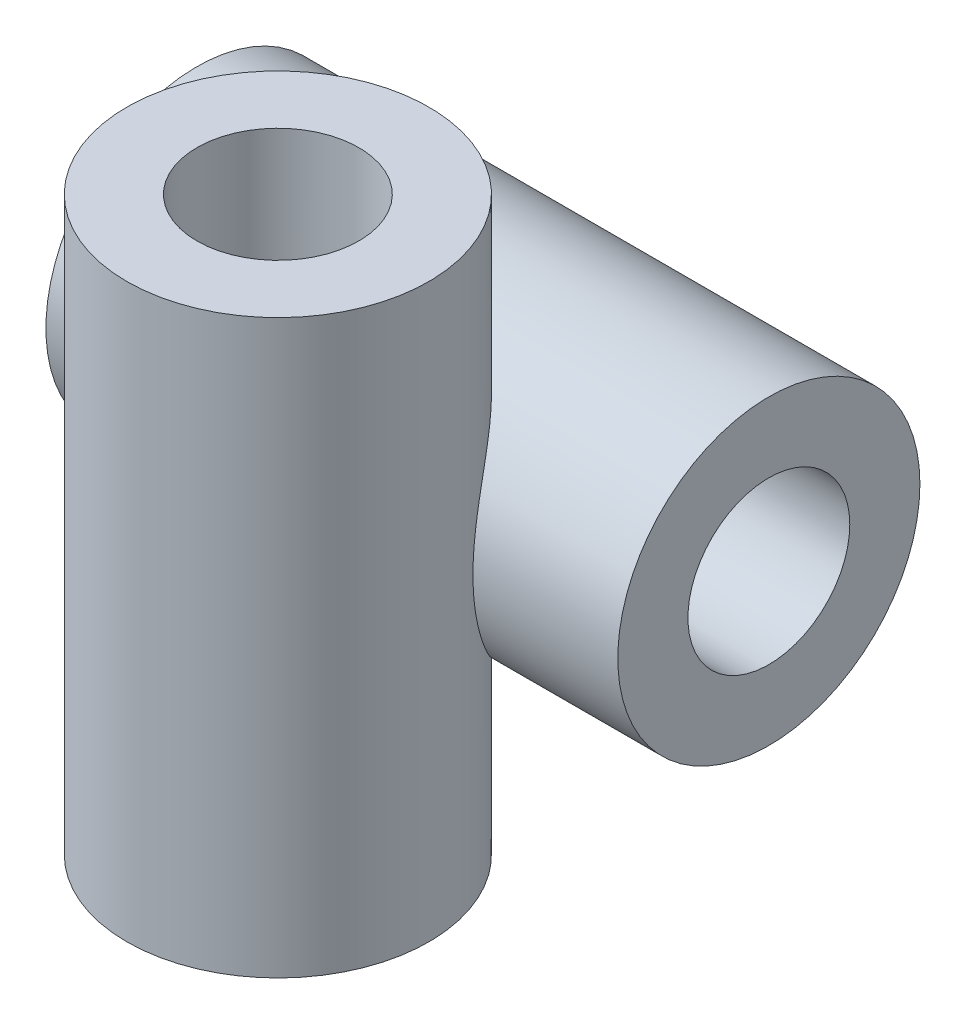
ISO-10303-21;
HEADER;
FILE_DESCRIPTION(('STEP AP214'),'2;1');
FILE_NAME('part.step','',(''),(''),'','','');
FILE_SCHEMA(('AUTOMOTIVE_DESIGN { 1 0 10303 214 1 1 1 1 }'));
ENDSEC;
DATA;
#1=APPLICATION_CONTEXT('core data for automotive mechanical design processes');
#2=APPLICATION_PROTOCOL_DEFINITION('international standard','automotive_design',2000,#1);
#3=PRODUCT_CONTEXT('',#1,'mechanical');
#4=PRODUCT('Part','Part','',(#3));
#5=PRODUCT_RELATED_PRODUCT_CATEGORY('part','',(#4));
#6=PRODUCT_DEFINITION_FORMATION('','',#4);
#7=PRODUCT_DEFINITION_CONTEXT('part definition',#1,'design');
#8=PRODUCT_DEFINITION('design','',#6,#7);
#9=PRODUCT_DEFINITION_SHAPE('','',#8);
#10=(LENGTH_UNIT() NAMED_UNIT(*) SI_UNIT(.MILLI.,.METRE.));
#11=(NAMED_UNIT(*) PLANE_ANGLE_UNIT() SI_UNIT($,.RADIAN.));
#12=(NAMED_UNIT(*) SI_UNIT($,.STERADIAN.) SOLID_ANGLE_UNIT());
#13=UNCERTAINTY_MEASURE_WITH_UNIT(LENGTH_MEASURE(1.E-05),#10,'distance_accuracy_value','');
#14=(GEOMETRIC_REPRESENTATION_CONTEXT(3) GLOBAL_UNCERTAINTY_ASSIGNED_CONTEXT((#13)) GLOBAL_UNIT_ASSIGNED_CONTEXT((#10,
#11,#12)) REPRESENTATION_CONTEXT('',''));
#15=CARTESIAN_POINT('',(0.,0.,0.));
#16=DIRECTION('',(0.,0.,1.));
#17=DIRECTION('',(1.,0.,0.));
#18=AXIS2_PLACEMENT_3D('',#15,#16,#17);
#19=CARTESIAN_POINT('',(1.55160412884561E-05,70.4899841667279,-12.71130350613));
#20=DIRECTION('',(0.,-1.,0.));
#21=DIRECTION('',(0.,0.,-1.));
#22=AXIS2_PLACEMENT_3D('',#19,#20,#21);
#23=CYLINDRICAL_SURFACE('',#22,9.24);
#24=CARTESIAN_POINT('',(1.55160412884561E-05,35.5099841667278,-12.71130350613));
#25=DIRECTION('',(0.,1.,0.));
#26=DIRECTION('',(0.,0.,1.));
#27=AXIS2_PLACEMENT_3D('',#24,#25,#26);
#28=CIRCLE('',#27,9.24);
#29=CARTESIAN_POINT('',(1.55160412884561E-05,35.5099841667278,-3.47130350612995));
#30=VERTEX_POINT('',#29);
#31=EDGE_CURVE('E56',#30,#30,#28,.T.);
#32=ORIENTED_EDGE('',*,*,#31,.T.);
#33=EDGE_LOOP('',(#32));
#34=FACE_BOUND('',#33,.T.);
#35=CARTESIAN_POINT('',(1.55160412884561E-05,70.4899841667279,-12.71130350613));
#36=DIRECTION('',(0.,1.,0.));
#37=DIRECTION('',(0.,0.,1.));
#38=AXIS2_PLACEMENT_3D('',#35,#36,#37);
#39=CIRCLE('',#38,9.24);
#40=CARTESIAN_POINT('',(1.55160412884561E-05,70.4899841667279,-3.47130350612995));
#41=VERTEX_POINT('',#40);
#42=EDGE_CURVE('E50',#41,#41,#39,.T.);
#43=ORIENTED_EDGE('',*,*,#42,.F.);
#44=EDGE_LOOP('',(#43));
#45=FACE_BOUND('',#44,.T.);
#46=CARTESIAN_POINT('',(1.55160412884561E-05,61.6306040749384,-21.95130350613));
#47=CARTESIAN_POINT('',(0.234307888367328,61.6306045683955,-21.9513029907115));
#48=CARTESIAN_POINT('',(0.468609521818782,61.6272100093109,-21.9423849967735));
#49=CARTESIAN_POINT('',(0.935666890545731,61.613473909932,-21.9067923668174));
#50=CARTESIAN_POINT('',(1.16842253202589,61.6031319519575,-21.8801166631997));
#51=CARTESIAN_POINT('',(1.63088469659122,61.5750241590349,-21.809248484714));
#52=CARTESIAN_POINT('',(1.86059016852276,61.5572558299694,-21.7650501251881));
#53=CARTESIAN_POINT('',(2.31525733761602,61.5135265031195,-21.6595833500892));
#54=CARTESIAN_POINT('',(2.54021911230549,61.4875656393391,-21.5983152137261));
#55=CARTESIAN_POINT('',(2.98437456056983,61.426327372644,-21.4591892471142));
#56=CARTESIAN_POINT('',(3.20355014135055,61.3910238543384,-21.381285034001));
#57=CARTESIAN_POINT('',(3.63375130068731,61.309865186933,-21.209960052989));
#58=CARTESIAN_POINT('',(3.84477678454717,61.264009915275,-21.1165391048677));
#59=CARTESIAN_POINT('',(4.25679317033168,61.1603615416393,-20.915567210769));
#60=CARTESIAN_POINT('',(4.4577899568298,61.1025755450603,-20.8080246887736));
#61=CARTESIAN_POINT('',(4.84811938070319,60.9735922713045,-20.5805157120026));
#62=CARTESIAN_POINT('',(5.0374529065203,60.9023960173265,-20.4605502054114));
#63=CARTESIAN_POINT('',(5.39358353234643,60.7491904205762,-20.2167167402529));
#64=CARTESIAN_POINT('',(5.56103544766152,60.6679064748228,-20.0933498123056));
#65=CARTESIAN_POINT('',(5.88265006136863,60.4910533252095,-19.8397076482819));
#66=CARTESIAN_POINT('',(6.03681326411398,60.3954846638813,-19.7094326746934));
#67=CARTESIAN_POINT('',(6.33074310584891,60.1894918672727,-19.4446970872391));
#68=CARTESIAN_POINT('',(6.4705193131107,60.0790777193792,-19.3102393337064));
#69=CARTESIAN_POINT('',(6.73514253355602,59.8431215727955,-19.0399240910245));
#70=CARTESIAN_POINT('',(6.85999069208659,59.7175807361786,-18.9040667101308));
#71=CARTESIAN_POINT('',(7.08324159815583,59.4644404138846,-18.6469297754818));
#72=CARTESIAN_POINT('',(7.18303348820171,59.3382061809643,-18.525507504074));
#73=CARTESIAN_POINT('',(7.37043523293995,59.0740605854918,-18.2860349910653));
#74=CARTESIAN_POINT('',(7.45804595253898,58.9361500531185,-18.1679845105284));
#75=CARTESIAN_POINT('',(7.62155013021054,58.6493334404229,-17.9371838934883));
#76=CARTESIAN_POINT('',(7.69744084429488,58.5004247971558,-17.8244350025232));
#77=CARTESIAN_POINT('',(7.83815250310703,58.1925391460784,-17.6060041202238));
#78=CARTESIAN_POINT('',(7.90297301893396,58.0335617484939,-17.5003224027945));
#79=CARTESIAN_POINT('',(8.02289813499006,57.7051055195842,-17.2966121927481));
#80=CARTESIAN_POINT('',(8.0779106511608,57.5355454811477,-17.1986606042314));
#81=CARTESIAN_POINT('',(8.1784298744629,57.1883454111082,-17.0127348144107));
#82=CARTESIAN_POINT('',(8.22393661847157,57.0107054108545,-16.9247605744006));
#83=CARTESIAN_POINT('',(8.30639728276878,56.6484352625333,-16.7597764216182));
#84=CARTESIAN_POINT('',(8.34334896136423,56.4638032970668,-16.6827693846239));
#85=CARTESIAN_POINT('',(8.40958045185977,56.0887153333145,-16.540529637796));
#86=CARTESIAN_POINT('',(8.43885965263639,55.898258872448,-16.4752978660073));
#87=CARTESIAN_POINT('',(8.49310211540702,55.4935629173235,-16.3513731763908));
#88=CARTESIAN_POINT('',(8.5173524840515,55.2788337100172,-16.2939643448014));
#89=CARTESIAN_POINT('',(8.55844022186776,54.8451184086921,-16.194671485618));
#90=CARTESIAN_POINT('',(8.57527717574613,54.6261320769101,-16.1527883277804));
#91=CARTESIAN_POINT('',(8.60220383354759,54.1852225871056,-16.0849204665914));
#92=CARTESIAN_POINT('',(8.61229117145266,53.9632984270241,-16.0589413385277));
#93=CARTESIAN_POINT('',(8.62612600884324,53.5179545992653,-16.0231283401164));
#94=CARTESIAN_POINT('',(8.62987332552428,53.2945348886527,-16.0132949353052));
#95=CARTESIAN_POINT('',(8.63123597065865,52.8314395931875,-16.0097346879661));
#96=CARTESIAN_POINT('',(8.62839015900744,52.5917522964422,-16.017219048111));
#97=CARTESIAN_POINT('',(8.61545917150989,52.1138673846327,-16.0507721133492));
#98=CARTESIAN_POINT('',(8.60537360414006,51.8756698508371,-16.0768418235313));
#99=CARTESIAN_POINT('',(8.57747602429513,51.4023811340971,-16.1473197966788));
#100=CARTESIAN_POINT('',(8.55966168298476,51.1672909094665,-16.1917335868914));
#101=CARTESIAN_POINT('',(8.51549765061546,50.7020143353225,-16.2984326566077));
#102=CARTESIAN_POINT('',(8.48914808972335,50.4718279110806,-16.360717663564));
#103=CARTESIAN_POINT('',(8.42669628337065,50.0172974601949,-16.5026997261046));
#104=CARTESIAN_POINT('',(8.39055887168689,49.7929777620026,-16.5824593639162));
#105=CARTESIAN_POINT('',(8.30721312339691,49.3528976721747,-16.7582185455915));
#106=CARTESIAN_POINT('',(8.26000459865354,49.1371374260671,-16.8542183654253));
#107=CARTESIAN_POINT('',(8.15303359936272,48.7162196977862,-17.0609498500252));
#108=CARTESIAN_POINT('',(8.09328021172954,48.5110546742321,-17.1716708302959));
#109=CARTESIAN_POINT('',(7.95963910825219,48.1130520995478,-17.4059991328531));
#110=CARTESIAN_POINT('',(7.88575288496964,47.9202132495233,-17.5296050937365));
#111=CARTESIAN_POINT('',(7.72834840505286,47.5621632304059,-17.7779063315059));
#112=CARTESIAN_POINT('',(7.64592235574676,47.3959627683439,-17.9018677664771));
#113=CARTESIAN_POINT('',(7.46674027153772,47.0769294962155,-18.1564698871914));
#114=CARTESIAN_POINT('',(7.36998502388518,46.9240959525,-18.2871102057365));
#115=CARTESIAN_POINT('',(7.16161097181465,46.6328743296997,-18.5523273534519));
#116=CARTESIAN_POINT('',(7.05000245214834,46.4944763723036,-18.6869014089445));
#117=CARTESIAN_POINT('',(6.81168514961775,46.2326180062947,-18.9571980309889));
#118=CARTESIAN_POINT('',(6.68497744603987,46.1091565312952,-19.0929205148079));
#119=CARTESIAN_POINT('',(6.42972757286173,45.8885593603104,-19.3495199261915));
#120=CARTESIAN_POINT('',(6.30254951024574,45.7900322617067,-19.4705624768428));
#121=CARTESIAN_POINT('',(6.03660288394222,45.6050994716245,-19.7090966910569));
#122=CARTESIAN_POINT('',(5.89783516151771,45.5186929015666,-19.826588611509));
#123=CARTESIAN_POINT('',(5.6094051418201,45.3575141465624,-20.056119880015));
#124=CARTESIAN_POINT('',(5.45974015789091,45.2827448450703,-20.1681578719968));
#125=CARTESIAN_POINT('',(5.15045450364686,45.1441798127795,-20.3850415859211));
#126=CARTESIAN_POINT('',(4.99083343003479,45.0803845269056,-20.4898870161486));
#127=CARTESIAN_POINT('',(4.66072158129196,44.9622437880648,-20.6921137070055));
#128=CARTESIAN_POINT('',(4.49012430839388,44.9080194382444,-20.789391645407));
#129=CARTESIAN_POINT('',(4.14092461381438,44.8090230619817,-20.973837453552));
#130=CARTESIAN_POINT('',(3.96232220899667,44.7642510156282,-21.061005344592));
#131=CARTESIAN_POINT('',(3.59820788324692,44.6832039200126,-21.2242602352022));
#132=CARTESIAN_POINT('',(3.41269416955125,44.6469310934499,-21.3003443341974));
#133=CARTESIAN_POINT('',(3.03592750729934,44.5820038146871,-21.4406366980936));
#134=CARTESIAN_POINT('',(2.84467410612097,44.5533499650727,-21.504844023537));
#135=CARTESIAN_POINT('',(2.4382859848243,44.5003563574474,-21.6265591905562));
#136=CARTESIAN_POINT('',(2.22266769698646,44.476728943001,-21.6827659098669));
#137=CARTESIAN_POINT('',(1.78727973079386,44.4368514812812,-21.779546490806));
#138=CARTESIAN_POINT('',(1.5675098182637,44.420601851459,-21.8201194678232));
#139=CARTESIAN_POINT('',(1.12514417692146,44.3948312468977,-21.8852712927559));
#140=CARTESIAN_POINT('',(0.902547480414025,44.3853126432601,-21.9098445042808));
#141=CARTESIAN_POINT('',(0.455977301772423,44.3726170027667,-21.9427623650401));
#142=CARTESIAN_POINT('',(0.232003781244019,44.3694401435695,-21.9511065596323));
#143=CARTESIAN_POINT('',(-0.231791284935753,44.3692857561969,-21.9515071904294));
#144=CARTESIAN_POINT('',(-0.471615033367401,44.3727618630994,-21.9423717849235));
#145=CARTESIAN_POINT('',(-0.949622253730592,44.3869946310837,-21.9055003913807));
#146=CARTESIAN_POINT('',(-1.18780563711832,44.3977516821133,-21.8777634070934));
#147=CARTESIAN_POINT('',(-1.66090651913192,44.4270646503931,-21.8039526263918));
#148=CARTESIAN_POINT('',(-1.8958230416473,44.4456228489464,-21.7578734663522));
#149=CARTESIAN_POINT('',(-2.36058623168515,44.4913769290576,-21.6478677534549));
#150=CARTESIAN_POINT('',(-2.59043298335919,44.5185726671281,-21.5839414970767));
#151=CARTESIAN_POINT('',(-3.04374743583956,44.5827987978729,-21.4388377169268));
#152=CARTESIAN_POINT('',(-3.26720106448936,44.6198492760344,-21.3576250290254));
#153=CARTESIAN_POINT('',(-3.70539360218753,44.7051360915225,-21.1790957746304));
#154=CARTESIAN_POINT('',(-3.92013237461819,44.7533726041265,-21.081778955803));
#155=CARTESIAN_POINT('',(-4.33884935252462,44.8625179997034,-20.87258864883));
#156=CARTESIAN_POINT('',(-4.54283549707335,44.9234173641605,-20.7607261180513));
#157=CARTESIAN_POINT('',(-4.93833651483838,45.0594633500976,-20.5243267599322));
#158=CARTESIAN_POINT('',(-5.12985272659899,45.1346084390185,-20.3997912966165));
#159=CARTESIAN_POINT('',(-5.48492652489328,45.2943889645318,-20.1501578995535));
#160=CARTESIAN_POINT('',(-5.64950410524081,45.3779017295261,-20.025791748431));
#161=CARTESIAN_POINT('',(-5.96525776317593,45.5592540606533,-19.7706451598672));
#162=CARTESIAN_POINT('',(-6.11643459268022,45.657092822136,-19.639865082952));
#163=CARTESIAN_POINT('',(-6.40435141764178,45.8675936440939,-19.3746343875289));
#164=CARTESIAN_POINT('',(-6.54110088269411,45.9802458710775,-19.2401862504729));
#165=CARTESIAN_POINT('',(-6.79970629261948,46.220568587838,-18.9704008967926));
#166=CARTESIAN_POINT('',(-6.92156325388418,46.3482380515421,-18.8350637415075));
#167=CARTESIAN_POINT('',(-7.13931637184246,46.6053595204028,-18.5792683917392));
#168=CARTESIAN_POINT('',(-7.23658078102887,46.7334733686342,-18.4586250536489));
#169=CARTESIAN_POINT('',(-7.41905146603635,47.0012030611272,-18.2210656773471));
#170=CARTESIAN_POINT('',(-7.50425860830806,47.1408180777582,-18.1041493717745));
#171=CARTESIAN_POINT('',(-7.66312251562039,47.4308390773362,-17.8759198590301));
#172=CARTESIAN_POINT('',(-7.73677636280965,47.5812477723547,-17.764608072116));
#173=CARTESIAN_POINT('',(-7.87320795860427,47.8919071802771,-17.5492991917871));
#174=CARTESIAN_POINT('',(-7.93598525207558,48.0521583046619,-17.4453024045797));
#175=CARTESIAN_POINT('',(-8.05235568389751,48.3839143537919,-17.2445784750325));
#176=CARTESIAN_POINT('',(-8.10579843025337,48.5555511545467,-17.1479823738318));
#177=CARTESIAN_POINT('',(-8.20328480591242,48.9067550182993,-16.9650326718384));
#178=CARTESIAN_POINT('',(-8.24732843677524,49.0863220799812,-16.8786790693461));
#179=CARTESIAN_POINT('',(-8.32697398622959,49.4522854916327,-16.7171690700367));
#180=CARTESIAN_POINT('',(-8.36257368090152,49.6386836258439,-16.6420156249911));
#181=CARTESIAN_POINT('',(-8.42620720066672,50.0171342778111,-16.5036862678206));
#182=CARTESIAN_POINT('',(-8.45424043173015,50.2091872382057,-16.4405112962205));
#183=CARTESIAN_POINT('',(-8.50599133686007,50.617259823538,-16.3210279415257));
#184=CARTESIAN_POINT('',(-8.52899767332604,50.833756386102,-16.2660368852201));
#185=CARTESIAN_POINT('',(-8.56766770455425,51.2707943036746,-16.1717944189791));
#186=CARTESIAN_POINT('',(-8.58333097989758,51.4913358889782,-16.1325439081262));
#187=CARTESIAN_POINT('',(-8.60794606058251,51.9351325992274,-16.0701314497402));
#188=CARTESIAN_POINT('',(-8.61689549354318,52.1583886550581,-16.0469751894301));
#189=CARTESIAN_POINT('',(-8.62844922898498,52.6061576374322,-16.0169731844956));
#190=CARTESIAN_POINT('',(-8.63105335894773,52.8306705979824,-16.0101278833396));
#191=CARTESIAN_POINT('',(-8.62999413853187,53.2951296207802,-16.0129010374687));
#192=CARTESIAN_POINT('',(-8.62588466219976,53.5350686691561,-16.0236914227187));
#193=CARTESIAN_POINT('',(-8.6103416090857,54.0131551866561,-16.0638862700448));
#194=CARTESIAN_POINT('',(-8.59890764394355,54.2513025601044,-16.0932917191306));
#195=CARTESIAN_POINT('',(-8.56816610475162,54.7241709848093,-16.1704346054781));
#196=CARTESIAN_POINT('',(-8.5488563039103,54.958891047581,-16.2181772271172));
#197=CARTESIAN_POINT('',(-8.50149455259141,55.4230946700372,-16.331482293292));
#198=CARTESIAN_POINT('',(-8.47344275951955,55.6525783239271,-16.3970444169723));
#199=CARTESIAN_POINT('',(-8.40742393009136,56.1046294738831,-16.5452495640358));
#200=CARTESIAN_POINT('',(-8.36945233083865,56.3271937343216,-16.6279004442192));
#201=CARTESIAN_POINT('',(-8.28220848938916,56.7634531184368,-16.8091659045937));
#202=CARTESIAN_POINT('',(-8.23293608542609,56.9771481151021,-16.9077807132958));
#203=CARTESIAN_POINT('',(-8.12160180389374,57.3936218625985,-17.1193876135936));
#204=CARTESIAN_POINT('',(-8.05954985658623,57.5964089359759,-17.2323685161846));
#205=CARTESIAN_POINT('',(-7.92108850436876,57.9893705468704,-17.4707883596692));
#206=CARTESIAN_POINT('',(-7.84468067104506,58.1795464618924,-17.5962259361816));
#207=CARTESIAN_POINT('',(-7.68252284821605,58.5316228492296,-17.847135975036));
#208=CARTESIAN_POINT('',(-7.59792555614255,58.694573757285,-17.9718800169989));
#209=CARTESIAN_POINT('',(-7.41441119770019,59.0070439464513,-18.2275174947044));
#210=CARTESIAN_POINT('',(-7.31549495227161,59.1565639967899,-18.3584105776173));
#211=CARTESIAN_POINT('',(-7.10288381177327,59.4411790775035,-18.6236020844325));
#212=CARTESIAN_POINT('',(-6.98919837411357,59.5762832390717,-18.7578982852358));
#213=CARTESIAN_POINT('',(-6.74689485626352,59.8316460501756,-19.0271231457398));
#214=CARTESIAN_POINT('',(-6.61827775050616,59.9519056674032,-19.1620517636184));
#215=CARTESIAN_POINT('',(-6.35930200119785,60.1668364166794,-19.4170114675464));
#216=CARTESIAN_POINT('',(-6.23025456766768,60.2628514975319,-19.5372462166393));
#217=CARTESIAN_POINT('',(-5.96074628693471,60.442887393096,-19.7738143286596));
#218=CARTESIAN_POINT('',(-5.82028624865525,60.526909056737,-19.8901479672726));
#219=CARTESIAN_POINT('',(-5.52867489525907,60.683487829389,-20.117066567754));
#220=CARTESIAN_POINT('',(-5.37752058919954,60.7560417126285,-20.2276499062719));
#221=CARTESIAN_POINT('',(-5.06548254158322,60.890369614019,-20.4413808661244));
#222=CARTESIAN_POINT('',(-4.9045983959315,60.9521431840327,-20.544528178239));
#223=CARTESIAN_POINT('',(-4.57118430859517,61.0667657552016,-20.7437450954878));
#224=CARTESIAN_POINT('',(-4.39849756002566,61.119435410302,-20.8396551503647));
#225=CARTESIAN_POINT('',(-4.04526687661534,61.2154280386613,-21.0211001177805));
#226=CARTESIAN_POINT('',(-3.8647228788881,61.2587509370956,-21.1066349472594));
#227=CARTESIAN_POINT('',(-3.49690060855654,61.3370056370482,-21.2663833502044));
#228=CARTESIAN_POINT('',(-3.30962109928129,61.3719358885019,-21.3405948314033));
#229=CARTESIAN_POINT('',(-2.92950006252055,61.434281473353,-21.4769361502783));
#230=CARTESIAN_POINT('',(-2.73665836301751,61.4616965740593,-21.5390656138422));
#231=CARTESIAN_POINT('',(-2.33632663495141,61.5110494659106,-21.6536010679251));
#232=CARTESIAN_POINT('',(-2.12859789616255,61.5326259273371,-21.7053288155193));
#233=CARTESIAN_POINT('',(-1.7094880529202,61.569064713129,-21.7943149572048));
#234=CARTESIAN_POINT('',(-1.49810687100624,61.5839268949171,-21.8315730440313));
#235=CARTESIAN_POINT('',(-1.0728743674009,61.6074874057243,-21.8913152750813));
#236=CARTESIAN_POINT('',(-0.859022440492288,61.6161841905188,-21.9137957178996));
#237=CARTESIAN_POINT('',(-0.43011114006764,61.6277424270686,-21.9437903993672));
#238=CARTESIAN_POINT('',(-0.215051713821696,61.6306036219725,-21.9513039792551));
#239=CARTESIAN_POINT('',(1.55160412884561E-05,61.6306040749384,-21.95130350613));
#240=B_SPLINE_CURVE_WITH_KNOTS('',3,(#46,#47,#48,#49,#50,#51,#52,#53,#54,#55,#56,#57,#58,#59,
#60,#61,#62,#63,#64,#65,#66,#67,#68,#69,#70,#71,#72,#73,#74,#75,#76,#77,#78,#79,#80,#81,#82,#83,
#84,#85,#86,#87,#88,#89,#90,#91,#92,#93,#94,#95,#96,#97,#98,#99,#100,#101,#102,#103,#104,#105,
#106,#107,#108,#109,#110,#111,#112,#113,#114,#115,#116,#117,#118,#119,#120,#121,#122,#123,#124,
#125,#126,#127,#128,#129,#130,#131,#132,#133,#134,#135,#136,#137,#138,#139,#140,#141,#142,#143,
#144,#145,#146,#147,#148,#149,#150,#151,#152,#153,#154,#155,#156,#157,#158,#159,#160,#161,#162,
#163,#164,#165,#166,#167,#168,#169,#170,#171,#172,#173,#174,#175,#176,#177,#178,#179,#180,#181,
#182,#183,#184,#185,#186,#187,#188,#189,#190,#191,#192,#193,#194,#195,#196,#197,#198,#199,#200,
#201,#202,#203,#204,#205,#206,#207,#208,#209,#210,#211,#212,#213,#214,#215,#216,#217,#218,#219,
#220,#221,#222,#223,#224,#225,#226,#227,#228,#229,#230,#231,#232,#233,#234,#235,#236,#237,#238,
#239),.UNSPECIFIED.,.T.,.F.,(4,2,2,2,2,2,2,2,2,2,2,2,2,2,2,2,2,2,2,2,2,2,2,2,2,2,2,2,2,2,2,2,2,
2,2,2,2,2,2,2,2,2,2,2,2,2,2,2,2,2,2,2,2,2,2,2,2,2,2,2,2,2,2,2,2,2,2,2,2,2,2,2,2,2,2,2,2,2,2,2,2,
2,2,2,2,2,2,2,2,2,2,2,2,2,2,2,4),(0.,0.702698636554692,1.40543952340448,2.10841661289225,
2.81138220448059,3.51633393080734,4.22129384552327,4.92583512290857,5.6303226657541,
6.29932097632964,6.9682938848793,7.63681896917869,8.30529272826903,8.90932172239623,
9.51330780637822,10.1174350870726,10.7215857686097,11.3311399506957,11.9406917679932,
12.5504031265009,13.1601630346102,13.8302077439049,14.5002899837803,15.1706069921572,
15.840943327733,16.5595650657276,17.2782256694667,17.9971029706832,18.715969309139,
19.4374534919426,20.1589499361879,20.8799255541191,21.600825072178,22.2692639625172,
22.9376661422406,23.6056078896077,24.2735019212496,24.8767628359106,25.4799799994381,
26.0833463895199,26.6867372364142,27.2972873097616,27.9078360969772,28.5185443759485,
29.1293009415548,29.8007918747425,30.4723207976277,31.1440861586261,31.8158703382903,
32.5350953850387,33.254358954615,33.9738330061821,34.6932951064196,35.4142349702096,
36.1351861313908,36.8555973086486,37.5759310277941,38.2426498070273,38.9093311529299,
39.5755721549322,40.2417676615354,40.8442512592384,41.4466915396874,42.0492837257806,
42.6519011215161,43.2634763016927,43.875051380388,44.4867873541071,45.0985713401883,
45.771499782345,46.4444666559581,47.1176712150362,47.7908940772375,48.510698483892,
49.2305410592891,49.9505873021857,50.6706205808935,51.3909856442885,52.1113610200513,
52.8311787305761,53.5509176861454,54.2159097171338,54.8808636376066,55.5453938364066,
56.2098806926592,56.8116232542173,57.4133232015178,58.0151921009111,58.6170860140169,
59.2297432012225,59.8424052928064,60.4551804520622,61.0679745825038,61.7128088997528,
62.3576569093775,63.0026663747218,63.6477042293132),.UNSPECIFIED.);
#241=CARTESIAN_POINT('',(1.55160412884561E-05,61.6306040749384,-21.95130350613));
#242=VERTEX_POINT('',#241);
#243=EDGE_CURVE('E10',#242,#242,#240,.T.);
#244=ORIENTED_EDGE('',*,*,#243,.F.);
#245=EDGE_LOOP('',(#244));
#246=FACE_BOUND('',#245,.T.);
#247=ADVANCED_FACE('F36',(#34,#45,#246),#23,.T.);
#248=CARTESIAN_POINT('',(1.55160412884561E-05,70.4899841667279,-12.71130350613));
#249=DIRECTION('',(0.,-1.,0.));
#250=DIRECTION('',(0.,0.,-1.));
#251=AXIS2_PLACEMENT_3D('',#248,#249,#250);
#252=CYLINDRICAL_SURFACE('',#251,4.95);
#253=CARTESIAN_POINT('',(1.55160412884561E-05,35.5099841667278,-12.71130350613));
#254=DIRECTION('',(0.,1.,0.));
#255=DIRECTION('',(0.,0.,1.));
#256=AXIS2_PLACEMENT_3D('',#253,#254,#255);
#257=CIRCLE('',#256,4.95);
#258=CARTESIAN_POINT('',(1.55160412884561E-05,35.5099841667278,-7.76130350612995));
#259=VERTEX_POINT('',#258);
#260=EDGE_CURVE('E105',#259,#259,#257,.T.);
#261=ORIENTED_EDGE('',*,*,#260,.F.);
#262=EDGE_LOOP('',(#261));
#263=FACE_BOUND('',#262,.T.);
#264=CARTESIAN_POINT('',(1.55160412884561E-05,70.4899841667279,-12.71130350613));
#265=DIRECTION('',(0.,1.,0.));
#266=DIRECTION('',(0.,0.,1.));
#267=AXIS2_PLACEMENT_3D('',#264,#265,#266);
#268=CIRCLE('',#267,4.95);
#269=CARTESIAN_POINT('',(1.55160412884561E-05,70.4899841667279,-7.76130350612995));
#270=VERTEX_POINT('',#269);
#271=EDGE_CURVE('E65',#270,#270,#268,.T.);
#272=ORIENTED_EDGE('',*,*,#271,.T.);
#273=EDGE_LOOP('',(#272));
#274=FACE_BOUND('',#273,.T.);
#275=CARTESIAN_POINT('',(1.55160412884561E-05,58.2696615762094,-17.66130350613));
#276=CARTESIAN_POINT('',(0.176787620764817,58.2696578965741,-17.6612980864996));
#277=CARTESIAN_POINT('',(0.353601518698305,58.2559743192295,-17.6517447464317));
#278=CARTESIAN_POINT('',(0.701087750340783,58.2017388336266,-17.6145250005897));
#279=CARTESIAN_POINT('',(0.871757829284754,58.1611771650632,-17.5868520150291));
#280=CARTESIAN_POINT('',(1.20091804879241,58.0549099212153,-17.5163615657235));
#281=CARTESIAN_POINT('',(1.35945193842152,57.9893003142681,-17.4736019515238));
#282=CARTESIAN_POINT('',(1.66119524721756,57.8352864804243,-17.3769358020125));
#283=CARTESIAN_POINT('',(1.80440298792011,57.7468797604778,-17.3230280476889));
#284=CARTESIAN_POINT('',(2.07388994770837,57.5498165155708,-17.2083157218327));
#285=CARTESIAN_POINT('',(2.20009390919684,57.4410747474637,-17.1474825555635));
#286=CARTESIAN_POINT('',(2.43432035429778,57.2067539124178,-17.0234095509991));
#287=CARTESIAN_POINT('',(2.54233655861039,57.0811690571984,-16.9601688907211));
#288=CARTESIAN_POINT('',(2.71661103861566,56.848549508654,-16.8502034823692));
#289=CARTESIAN_POINT('',(2.7866391496311,56.7444191934073,-16.8031984630859));
#290=CARTESIAN_POINT('',(2.91719656394847,56.5294868239447,-16.7111705427167));
#291=CARTESIAN_POINT('',(2.97772214968991,56.418682181951,-16.6661484223081));
#292=CARTESIAN_POINT('',(3.08999745392898,56.1913339651738,-16.5790640016577));
#293=CARTESIAN_POINT('',(3.14173020332067,56.0747798412839,-16.5370075141876));
#294=CARTESIAN_POINT('',(3.23699678607834,55.8370747848637,-16.4567445821183));
#295=CARTESIAN_POINT('',(3.28052860252769,55.715922730309,-16.4185390856935));
#296=CARTESIAN_POINT('',(3.37237908525391,55.4318001245709,-16.3354740687278));
#297=CARTESIAN_POINT('',(3.418011165171,55.2674892290997,-16.2922134557718));
#298=CARTESIAN_POINT('',(3.49775031631565,54.9340751576568,-16.2143664776486));
#299=CARTESIAN_POINT('',(3.53185387700408,54.7649705389123,-16.1797827554987));
#300=CARTESIAN_POINT('',(3.58964863979894,54.4232889969172,-16.1199343977915));
#301=CARTESIAN_POINT('',(3.61333449337273,54.2507103375034,-16.094674550252));
#302=CARTESIAN_POINT('',(3.65107661087724,53.9033894192635,-16.0539106190883));
#303=CARTESIAN_POINT('',(3.6651336901428,53.7286473449046,-16.0384057094551));
#304=CARTESIAN_POINT('',(3.68425800667787,53.3754852117437,-16.0172170479342));
#305=CARTESIAN_POINT('',(3.68918945741086,53.1970489401387,-16.0116816713867));
#306=CARTESIAN_POINT('',(3.68983239633273,52.8401278423454,-16.0109627994754));
#307=CARTESIAN_POINT('',(3.68554328964773,52.6616430137673,-16.0157799720171));
#308=CARTESIAN_POINT('',(3.66758796518232,52.3057553632974,-16.0356970128843));
#309=CARTESIAN_POINT('',(3.6539236839315,52.128352325585,-16.050794757657));
#310=CARTESIAN_POINT('',(3.61672553400213,51.7757421256098,-16.0910466748892));
#311=CARTESIAN_POINT('',(3.59319301702973,51.6005346659903,-16.1161994700315));
#312=CARTESIAN_POINT('',(3.53906030493981,51.2753803984383,-16.1723695866393));
#313=CARTESIAN_POINT('',(3.50972052711522,51.1250269577963,-16.2022521371363));
#314=CARTESIAN_POINT('',(3.44209938935656,50.8278832081144,-16.2689456071782));
#315=CARTESIAN_POINT('',(3.40381779209926,50.6810929937596,-16.3057567106074));
#316=CARTESIAN_POINT('',(3.31744083856469,50.3923463910632,-16.3856259600517));
#317=CARTESIAN_POINT('',(3.2693565181084,50.2503847746129,-16.428677065511));
#318=CARTESIAN_POINT('',(3.1623050283261,49.9724270253236,-16.5201593431908));
#319=CARTESIAN_POINT('',(3.10334137087789,49.8364289849108,-16.5685887772704));
#320=CARTESIAN_POINT('',(2.99038776539246,49.6064066603406,-16.6564095791947));
#321=CARTESIAN_POINT('',(2.93911193099276,49.5106865897482,-16.6948635971639));
#322=CARTESIAN_POINT('',(2.8295992165747,49.3240187608395,-16.7733838324736));
#323=CARTESIAN_POINT('',(2.77136400827739,49.233069863956,-16.813449661111));
#324=CARTESIAN_POINT('',(2.64761726311,49.0567763284698,-16.8943838609161));
#325=CARTESIAN_POINT('',(2.58211342176498,48.9714259121236,-16.9352513462991));
#326=CARTESIAN_POINT('',(2.44355713307615,48.8070784634206,-17.0168894977873));
#327=CARTESIAN_POINT('',(2.37050609799821,48.7280802473129,-17.0576601805514));
#328=CARTESIAN_POINT('',(2.16852635890754,48.5300320507435,-17.1632652656397));
#329=CARTESIAN_POINT('',(2.03323136459974,48.4168443107677,-17.2271969836207));
#330=CARTESIAN_POINT('',(1.74303125008367,48.2133053688338,-17.3469167421493));
#331=CARTESIAN_POINT('',(1.58813192065578,48.1229474468635,-17.4027071770558));
#332=CARTESIAN_POINT('',(1.34296418760746,48.0068878283013,-17.4764263517039));
#333=CARTESIAN_POINT('',(1.258744623949,47.9713455957803,-17.4994095324278));
#334=CARTESIAN_POINT('',(1.08672768031607,47.9072716103665,-17.5413524617952));
#335=CARTESIAN_POINT('',(0.998931998259713,47.878736574711,-17.5603140939021));
#336=CARTESIAN_POINT('',(0.820463792980609,47.8289769606004,-17.5936808908993));
#337=CARTESIAN_POINT('',(0.729791654849536,47.8077514080458,-17.6080866629062));
#338=CARTESIAN_POINT('',(0.54636940479311,47.7728276200207,-17.6319279579856));
#339=CARTESIAN_POINT('',(0.453619552801435,47.7591284483709,-17.6413640992064));
#340=CARTESIAN_POINT('',(0.277954397618017,47.740565505376,-17.6541840060703));
#341=CARTESIAN_POINT('',(0.195170163499828,47.7348498590329,-17.6581505939474));
#342=CARTESIAN_POINT('',(0.0292802982506019,47.729428716049,-17.6619124510577));
#343=CARTESIAN_POINT('',(-0.0538254314709936,47.7297252382685,-17.6617063191096));
#344=CARTESIAN_POINT('',(-0.219626964046198,47.7363320946932,-17.657122539097));
#345=CARTESIAN_POINT('',(-0.302323014500645,47.7426381909032,-17.6527478307433));
#346=CARTESIAN_POINT('',(-0.466736558053422,47.7611991839099,-17.63994021738));
#347=CARTESIAN_POINT('',(-0.548453678313019,47.7734562777634,-17.6315058135761));
#348=CARTESIAN_POINT('',(-0.784549275261528,47.817784274821,-17.6012248995916));
#349=CARTESIAN_POINT('',(-0.936884700050321,47.8577190163241,-17.5741707813028));
#350=CARTESIAN_POINT('',(-1.23177008051542,47.9579498709296,-17.5079808296052));
#351=CARTESIAN_POINT('',(-1.37431955566369,48.018246983044,-17.4688444034262));
#352=CARTESIAN_POINT('',(-1.65401143830648,48.1610578725092,-17.3792110444474));
#353=CARTESIAN_POINT('',(-1.79049096184776,48.2445609216126,-17.328230539982));
#354=CARTESIAN_POINT('',(-2.04777495699615,48.4296851231515,-17.2200258500748));
#355=CARTESIAN_POINT('',(-2.16857172180142,48.5313151257162,-17.1627986201113));
#356=CARTESIAN_POINT('',(-2.36037803449806,48.7174356744035,-17.0632019530512));
#357=CARTESIAN_POINT('',(-2.43552935166258,48.798072313093,-17.0214587008391));
#358=CARTESIAN_POINT('',(-2.57791319513941,48.9660410633383,-16.9378386932616));
#359=CARTESIAN_POINT('',(-2.64514320782205,49.0533752857704,-16.8959618998265));
#360=CARTESIAN_POINT('',(-2.77201524360536,49.2339634293065,-16.8130229777924));
#361=CARTESIAN_POINT('',(-2.83164504619403,49.3272265315598,-16.7719622486353));
#362=CARTESIAN_POINT('',(-2.94360395521112,49.5187488812425,-16.6915489749479));
#363=CARTESIAN_POINT('',(-2.99593119079096,49.6170094001977,-16.6521968699231));
#364=CARTESIAN_POINT('',(-3.10998764562831,49.8511487075696,-16.5632150026363));
#365=CARTESIAN_POINT('',(-3.1690631710126,49.988677985313,-16.5145152558799));
#366=CARTESIAN_POINT('',(-3.27618185369961,50.2697521592356,-16.4226387522264));
#367=CARTESIAN_POINT('',(-3.32422131712728,50.4132990506128,-16.3794638466822));
#368=CARTESIAN_POINT('',(-3.41035132473662,50.7051609102493,-16.2995274825204));
#369=CARTESIAN_POINT('',(-3.44843624493929,50.8534785208946,-16.2627696532105));
#370=CARTESIAN_POINT('',(-3.51555732564122,51.1536734718595,-16.196339425757));
#371=CARTESIAN_POINT('',(-3.54459416914293,51.3055505425591,-16.166666492843));
#372=CARTESIAN_POINT('',(-3.5949681452367,51.6154775989645,-16.1142353189219));
#373=CARTESIAN_POINT('',(-3.61611042595629,51.7735889923615,-16.0916540104757));
#374=CARTESIAN_POINT('',(-3.65033381609646,52.0916232027617,-16.054667532496));
#375=CARTESIAN_POINT('',(-3.66341481880909,52.2515460437146,-16.0402624711925));
#376=CARTESIAN_POINT('',(-3.68190629339405,52.5724484468536,-16.019799013753));
#377=CARTESIAN_POINT('',(-3.68731274990397,52.7334285179725,-16.0137449869684));
#378=CARTESIAN_POINT('',(-3.69060318099658,53.0555644609558,-16.0100663556464));
#379=CARTESIAN_POINT('',(-3.68848672406625,53.2167203423745,-16.0124422346469));
#380=CARTESIAN_POINT('',(-3.67558707421335,53.5679275238107,-16.0268079799471));
#381=CARTESIAN_POINT('',(-3.6632859501573,53.757859053685,-16.0404807385828));
#382=CARTESIAN_POINT('',(-3.62755325810783,54.135531975923,-16.0793802738215));
#383=CARTESIAN_POINT('',(-3.60411903471547,54.32327283483,-16.1046098068245));
#384=CARTESIAN_POINT('',(-3.54518916606447,54.6948881372839,-16.1661318807467));
#385=CARTESIAN_POINT('',(-3.50970220603943,54.8787652640132,-16.2024164534427));
#386=CARTESIAN_POINT('',(-3.42530372646734,55.2410113183603,-16.2852639690023));
#387=CARTESIAN_POINT('',(-3.37639863742055,55.4193828390445,-16.3318219863363));
#388=CARTESIAN_POINT('',(-3.28119829593959,55.713677516784,-16.4178977745064));
#389=CARTESIAN_POINT('',(-3.23891332627774,55.8316087551195,-16.4550294876408));
#390=CARTESIAN_POINT('',(-3.14659163424312,56.0631355143079,-16.5329545862979));
#391=CARTESIAN_POINT('',(-3.09655692051809,56.1767321491598,-16.5737470218528));
#392=CARTESIAN_POINT('',(-2.98815004143419,56.3985752869308,-16.6582110236426));
#393=CARTESIAN_POINT('',(-2.92978935153186,56.5068288820808,-16.7018785832908));
#394=CARTESIAN_POINT('',(-2.80410037562781,56.717098664637,-16.7911777801418));
#395=CARTESIAN_POINT('',(-2.73677415684066,56.8191162820073,-16.8368089629481));
#396=CARTESIAN_POINT('',(-2.5516560622848,57.0716901321663,-16.9550598196108));
#397=CARTESIAN_POINT('',(-2.42689210114418,57.2169772150339,-17.0283146241705));
#398=CARTESIAN_POINT('',(-2.15305477317755,57.4846583496677,-17.1711826449327));
#399=CARTESIAN_POINT('',(-2.00400525749855,57.6070746124549,-17.2407993464452));
#400=CARTESIAN_POINT('',(-1.7071196661242,57.80783684202,-17.3599340371325));
#401=CARTESIAN_POINT('',(-1.56248741500402,57.8900443482902,-17.4108998383308));
#402=CARTESIAN_POINT('',(-1.25910043839339,58.0317780657937,-17.5010942433443));
#403=CARTESIAN_POINT('',(-1.10035487250204,58.0913188571672,-17.5403303886449));
#404=CARTESIAN_POINT('',(-0.786272364799648,58.1817723022059,-17.6008520469713));
#405=CARTESIAN_POINT('',(-0.631733294241805,58.2146403887154,-17.6233507409612));
#406=CARTESIAN_POINT('',(-0.318135901663321,58.2585877970717,-17.6535796654573));
#407=CARTESIAN_POINT('',(-0.159077118580246,58.2696648878341,-17.661308383728));
#408=CARTESIAN_POINT('',(1.55160412884561E-05,58.2696615762094,-17.66130350613));
#409=B_SPLINE_CURVE_WITH_KNOTS('',3,(#275,#276,#277,#278,#279,#280,#281,#282,#283,#284,#285,
#286,#287,#288,#289,#290,#291,#292,#293,#294,#295,#296,#297,#298,#299,#300,#301,#302,#303,#304,
#305,#306,#307,#308,#309,#310,#311,#312,#313,#314,#315,#316,#317,#318,#319,#320,#321,#322,#323,
#324,#325,#326,#327,#328,#329,#330,#331,#332,#333,#334,#335,#336,#337,#338,#339,#340,#341,#342,
#343,#344,#345,#346,#347,#348,#349,#350,#351,#352,#353,#354,#355,#356,#357,#358,#359,#360,#361,
#362,#363,#364,#365,#366,#367,#368,#369,#370,#371,#372,#373,#374,#375,#376,#377,#378,#379,#380,
#381,#382,#383,#384,#385,#386,#387,#388,#389,#390,#391,#392,#393,#394,#395,#396,#397,#398,#399,
#400,#401,#402,#403,#404,#405,#406,#407,#408),.UNSPECIFIED.,.T.,.F.,(4,2,2,2,2,2,2,2,2,2,2,2,2,
2,2,2,2,2,2,2,2,2,2,2,2,2,2,2,2,2,2,2,2,2,2,2,2,2,2,2,2,2,2,2,2,2,2,2,2,2,2,2,2,2,2,2,2,2,2,2,2,
2,2,2,2,2,4),(0.,0.529623116361425,1.05943866149369,1.58724432598525,2.11510773481896,
2.64523563784568,3.17554619323168,3.5770361409761,3.97868276957757,4.38109593660435,
4.78360794327129,5.31066458398492,5.83788157397885,6.36536892625245,6.89281160700394,
7.42804125002951,7.9633054249904,8.49845906942642,9.03353943487624,9.50135258059247,
9.9691781438649,10.4364799130863,10.903631099176,11.2489357181461,11.5941575571049,
11.9390173248795,12.2838126773768,12.8443159258612,13.40465399614,13.6870765580356,
13.9693665558396,14.2516189196454,14.5338361671516,14.7827495111438,15.0317464405437,
15.2805679053328,15.529481302779,16.0065143779389,16.4835708605408,16.9853460421671,
17.487366879628,17.8405241745146,18.1937932350087,18.5476233432677,18.9015439336956,
19.3730699308553,19.8447535230556,20.316703027266,20.7886168972955,21.2715099274424,
21.7544093495556,22.2375613341463,22.7207410326982,23.2925138411374,23.8644230938599,
24.4359210985938,25.0071456957438,25.3988447551622,25.7904424598957,26.1815055594024,
26.5724786456924,27.1850927262722,27.7971087378231,28.3168701024484,28.8362965685253,
29.3129018082407,29.789555842938),.UNSPECIFIED.);
#410=CARTESIAN_POINT('',(1.55160412884561E-05,58.2696615762094,-17.66130350613));
#411=VERTEX_POINT('',#410);
#412=EDGE_CURVE('E40',#411,#411,#409,.T.);
#413=ORIENTED_EDGE('',*,*,#412,.T.);
#414=EDGE_LOOP('',(#413));
#415=FACE_BOUND('',#414,.T.);
#416=ADVANCED_FACE('F77',(#263,#274,#415),#252,.F.);
#417=CARTESIAN_POINT('',(1.55160412884561E-05,70.4899841667279,-12.71130350613));
#418=DIRECTION('',(0.,1.,0.));
#419=DIRECTION('',(0.,0.,1.));
#420=AXIS2_PLACEMENT_3D('',#417,#418,#419);
#421=PLANE('',#420);
#422=ORIENTED_EDGE('',*,*,#42,.T.);
#423=EDGE_LOOP('',(#422));
#424=FACE_BOUND('',#423,.T.);
#425=ORIENTED_EDGE('',*,*,#271,.F.);
#426=EDGE_LOOP('',(#425));
#427=FACE_BOUND('',#426,.T.);
#428=ADVANCED_FACE('F82',(#424,#427),#421,.T.);
#429=CARTESIAN_POINT('',(1.55160412884561E-05,35.5099841667278,-12.71130350613));
#430=DIRECTION('',(0.,1.,0.));
#431=DIRECTION('',(0.,0.,1.));
#432=AXIS2_PLACEMENT_3D('',#429,#430,#431);
#433=PLANE('',#432);
#434=ORIENTED_EDGE('',*,*,#31,.F.);
#435=EDGE_LOOP('',(#434));
#436=FACE_BOUND('',#435,.T.);
#437=ORIENTED_EDGE('',*,*,#260,.T.);
#438=EDGE_LOOP('',(#437));
#439=FACE_BOUND('',#438,.T.);
#440=ADVANCED_FACE('F72',(#436,#439),#433,.F.);
#441=CARTESIAN_POINT('',(17.4900155160413,52.9999841667278,-25.25130350613));
#442=DIRECTION('',(-1.,0.,0.));
#443=DIRECTION('',(0.,0.,1.));
#444=AXIS2_PLACEMENT_3D('',#441,#442,#443);
#445=CYLINDRICAL_SURFACE('',#444,9.24);
#446=ORIENTED_EDGE('',*,*,#412,.F.);
#447=EDGE_LOOP('',(#446));
#448=FACE_BOUND('',#447,.T.);
#449=ADVANCED_FACE('F67',(#448),#445,.T.);
#450=CARTESIAN_POINT('',(17.4900155160413,52.9999841667278,-25.25130350613));
#451=DIRECTION('',(-1.,0.,0.));
#452=DIRECTION('',(0.,0.,1.));
#453=AXIS2_PLACEMENT_3D('',#450,#451,#452);
#454=CYLINDRICAL_SURFACE('',#453,4.95);
#455=CARTESIAN_POINT('',(17.4900155160413,52.9999841667278,-25.25130350613));
#456=DIRECTION('',(1.,0.,0.));
#457=DIRECTION('',(0.,0.,-1.));
#458=AXIS2_PLACEMENT_3D('',#455,#456,#457);
#459=CIRCLE('',#458,4.95);
#460=CARTESIAN_POINT('',(17.4900155160413,52.9999841667278,-30.20130350613));
#461=VERTEX_POINT('',#460);
#462=EDGE_CURVE('E121',#461,#461,#459,.T.);
#463=ORIENTED_EDGE('',*,*,#462,.T.);
#464=EDGE_LOOP('',(#463));
#465=FACE_BOUND('',#464,.T.);
#466=CARTESIAN_POINT('',(-17.4899844839587,52.9999841667278,-25.25130350613));
#467=DIRECTION('',(1.,0.,0.));
#468=DIRECTION('',(0.,0.,-1.));
#469=AXIS2_PLACEMENT_3D('',#466,#467,#468);
#470=CIRCLE('',#469,4.95);
#471=CARTESIAN_POINT('',(-17.4899844839587,52.9999841667278,-30.20130350613));
#472=VERTEX_POINT('',#471);
#473=EDGE_CURVE('E123',#472,#472,#470,.T.);
#474=ORIENTED_EDGE('',*,*,#473,.F.);
#475=EDGE_LOOP('',(#474));
#476=FACE_BOUND('',#475,.T.);
#477=ADVANCED_FACE('F71',(#465,#476),#454,.F.);
#478=CARTESIAN_POINT('',(17.4900155160413,52.9999841667278,-25.25130350613));
#479=DIRECTION('',(1.,0.,0.));
#480=DIRECTION('',(0.,0.,-1.));
#481=AXIS2_PLACEMENT_3D('',#478,#479,#480);
#482=CIRCLE('',#481,9.24);
#483=CARTESIAN_POINT('',(17.4900155160413,52.9999841667278,-34.49130350613));
#484=VERTEX_POINT('',#483);
#485=EDGE_CURVE('E112',#484,#484,#482,.T.);
#486=ORIENTED_EDGE('',*,*,#485,.F.);
#487=EDGE_LOOP('',(#486));
#488=FACE_BOUND('',#487,.T.);
#489=CARTESIAN_POINT('',(-17.4899844839587,52.9999841667278,-25.25130350613));
#490=DIRECTION('',(1.,0.,0.));
#491=DIRECTION('',(0.,0.,-1.));
#492=AXIS2_PLACEMENT_3D('',#489,#490,#491);
#493=CIRCLE('',#492,9.24);
#494=CARTESIAN_POINT('',(-17.4899844839587,52.9999841667278,-34.49130350613));
#495=VERTEX_POINT('',#494);
#496=EDGE_CURVE('E63',#495,#495,#493,.T.);
#497=ORIENTED_EDGE('',*,*,#496,.T.);
#498=EDGE_LOOP('',(#497));
#499=FACE_BOUND('',#498,.T.);
#500=ORIENTED_EDGE('',*,*,#243,.T.);
#501=EDGE_LOOP('',(#500));
#502=FACE_BOUND('',#501,.T.);
#503=ADVANCED_FACE('F74',(#488,#499,#502),#445,.T.);
#504=CARTESIAN_POINT('',(17.4900155160413,52.9999841667278,-25.25130350613));
#505=DIRECTION('',(1.,0.,0.));
#506=DIRECTION('',(0.,0.,-1.));
#507=AXIS2_PLACEMENT_3D('',#504,#505,#506);
#508=PLANE('',#507);
#509=ORIENTED_EDGE('',*,*,#485,.T.);
#510=EDGE_LOOP('',(#509));
#511=FACE_BOUND('',#510,.T.);
#512=ORIENTED_EDGE('',*,*,#462,.F.);
#513=EDGE_LOOP('',(#512));
#514=FACE_BOUND('',#513,.T.);
#515=ADVANCED_FACE('F133',(#511,#514),#508,.T.);
#516=CARTESIAN_POINT('',(-17.4899844839587,52.9999841667278,-25.25130350613));
#517=DIRECTION('',(1.,0.,0.));
#518=DIRECTION('',(0.,0.,-1.));
#519=AXIS2_PLACEMENT_3D('',#516,#517,#518);
#520=PLANE('',#519);
#521=ORIENTED_EDGE('',*,*,#496,.F.);
#522=EDGE_LOOP('',(#521));
#523=FACE_BOUND('',#522,.T.);
#524=ORIENTED_EDGE('',*,*,#473,.T.);
#525=EDGE_LOOP('',(#524));
#526=FACE_BOUND('',#525,.T.);
#527=ADVANCED_FACE('F75',(#523,#526),#520,.F.);
#528=CLOSED_SHELL('',(#247,#416,#428,#440,#449,#477,#503,#515,#527));
#529=MANIFOLD_SOLID_BREP('B2',#528);
#530=ADVANCED_BREP_SHAPE_REPRESENTATION('',(#18,#529),#14);
#531=SHAPE_DEFINITION_REPRESENTATION(#9,#530);
ENDSEC;
END-ISO-10303-21;
